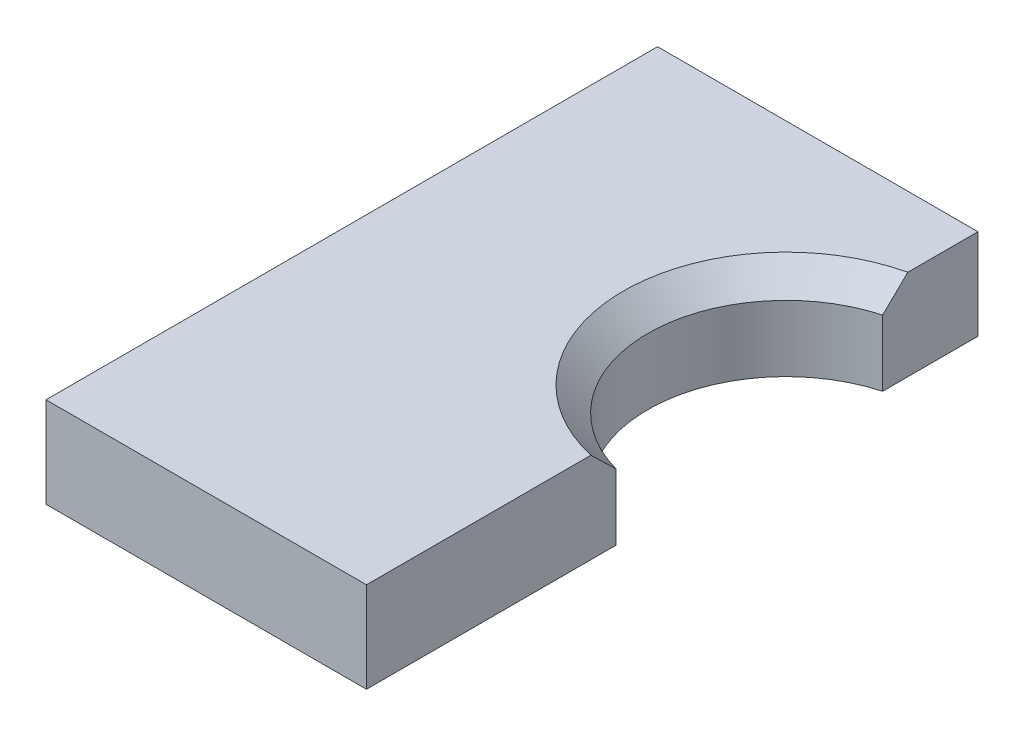
ISO-10303-21;
HEADER;
FILE_DESCRIPTION(('STEP AP214'),'2;1');
FILE_NAME('part.step','',(''),(''),'','','');
FILE_SCHEMA(('AUTOMOTIVE_DESIGN { 1 0 10303 214 1 1 1 1 }'));
ENDSEC;
DATA;
#1=APPLICATION_CONTEXT('core data for automotive mechanical design processes');
#2=APPLICATION_PROTOCOL_DEFINITION('international standard','automotive_design',2000,#1);
#3=PRODUCT_CONTEXT('',#1,'mechanical');
#4=PRODUCT('Part','Part','',(#3));
#5=PRODUCT_RELATED_PRODUCT_CATEGORY('part','',(#4));
#6=PRODUCT_DEFINITION_FORMATION('','',#4);
#7=PRODUCT_DEFINITION_CONTEXT('part definition',#1,'design');
#8=PRODUCT_DEFINITION('design','',#6,#7);
#9=PRODUCT_DEFINITION_SHAPE('','',#8);
#10=(LENGTH_UNIT() NAMED_UNIT(*) SI_UNIT(.MILLI.,.METRE.));
#11=(NAMED_UNIT(*) PLANE_ANGLE_UNIT() SI_UNIT($,.RADIAN.));
#12=(NAMED_UNIT(*) SI_UNIT($,.STERADIAN.) SOLID_ANGLE_UNIT());
#13=UNCERTAINTY_MEASURE_WITH_UNIT(LENGTH_MEASURE(1.E-05),#10,'distance_accuracy_value','');
#14=(GEOMETRIC_REPRESENTATION_CONTEXT(3) GLOBAL_UNCERTAINTY_ASSIGNED_CONTEXT((#13)) GLOBAL_UNIT_ASSIGNED_CONTEXT((#10,
#11,#12)) REPRESENTATION_CONTEXT('',''));
#15=CARTESIAN_POINT('',(0.,0.,0.));
#16=DIRECTION('',(0.,0.,1.));
#17=DIRECTION('',(1.,0.,0.));
#18=AXIS2_PLACEMENT_3D('',#15,#16,#17);
#19=CARTESIAN_POINT('',(14.6,3.7,-19.65));
#20=DIRECTION('',(0.,-1.,0.));
#21=DIRECTION('',(0.,0.,-1.));
#22=AXIS2_PLACEMENT_3D('',#19,#20,#21);
#23=CYLINDRICAL_SURFACE('',#22,5.65);
#24=DIRECTION('',(0.,-1.,0.));
#25=VECTOR('',#24,1.);
#26=CARTESIAN_POINT('',(13.1,3.7,-25.0972470111057));
#27=LINE('',#26,#25);
#28=CARTESIAN_POINT('',(13.1,2.69999999999999,-25.0972470111057));
#29=VERTEX_POINT('',#28);
#30=CARTESIAN_POINT('',(13.1,0.,-25.0972470111057));
#31=VERTEX_POINT('',#30);
#32=EDGE_CURVE('E135',#29,#31,#27,.T.);
#33=ORIENTED_EDGE('',*,*,#32,.F.);
#34=CARTESIAN_POINT('',(14.6,2.69999999999999,-19.65));
#35=DIRECTION('',(0.,1.,0.));
#36=DIRECTION('',(0.,0.,1.));
#37=AXIS2_PLACEMENT_3D('',#34,#35,#36);
#38=CIRCLE('',#37,5.65);
#39=CARTESIAN_POINT('',(13.1,2.69999999999999,-14.2027529888943));
#40=VERTEX_POINT('',#39);
#41=EDGE_CURVE('E178',#29,#40,#38,.T.);
#42=ORIENTED_EDGE('',*,*,#41,.T.);
#43=DIRECTION('',(0.,-1.,0.));
#44=VECTOR('',#43,1.);
#45=CARTESIAN_POINT('',(13.1,3.7,-14.2027529888943));
#46=LINE('',#45,#44);
#47=CARTESIAN_POINT('',(13.1,0.,-14.2027529888943));
#48=VERTEX_POINT('',#47);
#49=EDGE_CURVE('E164',#40,#48,#46,.T.);
#50=ORIENTED_EDGE('',*,*,#49,.T.);
#51=CARTESIAN_POINT('',(14.6,0.,-19.65));
#52=DIRECTION('',(0.,1.,0.));
#53=DIRECTION('',(0.,0.,1.));
#54=AXIS2_PLACEMENT_3D('',#51,#52,#53);
#55=CIRCLE('',#54,5.65);
#56=EDGE_CURVE('E148',#31,#48,#55,.T.);
#57=ORIENTED_EDGE('',*,*,#56,.F.);
#58=EDGE_LOOP('',(#33,#42,#50,#57));
#59=FACE_BOUND('',#58,.T.);
#60=ADVANCED_FACE('F49',(#59),#23,.F.);
#61=CARTESIAN_POINT('',(13.1,3.7,0.));
#62=DIRECTION('',(-1.,0.,0.));
#63=DIRECTION('',(0.,0.,1.));
#64=AXIS2_PLACEMENT_3D('',#61,#62,#63);
#65=PLANE('',#64);
#66=DIRECTION('',(0.,0.,-1.));
#67=VECTOR('',#66,1.);
#68=CARTESIAN_POINT('',(13.1,3.7,0.));
#69=LINE('',#68,#67);
#70=CARTESIAN_POINT('',(13.1,3.7,-26.1286186799348));
#71=VERTEX_POINT('',#70);
#72=CARTESIAN_POINT('',(13.1,3.7,-28.9972470111057));
#73=VERTEX_POINT('',#72);
#74=EDGE_CURVE('E113',#71,#73,#69,.T.);
#75=ORIENTED_EDGE('',*,*,#74,.F.);
#76=CARTESIAN_POINT('',(13.1,3.7,-26.1286186799348));
#77=CARTESIAN_POINT('',(13.1,3.61646172938487,-26.0428699402354));
#78=CARTESIAN_POINT('',(13.1,3.53296614374926,-25.9570795900868));
#79=CARTESIAN_POINT('',(13.1,3.36607283627571,-25.7854040370785));
#80=CARTESIAN_POINT('',(13.1,3.28267511427363,-25.6995188343785));
#81=CARTESIAN_POINT('',(13.1,3.11598971569389,-25.5276416239988));
#82=CARTESIAN_POINT('',(13.1,3.03270203915782,-25.4416496162788));
#83=CARTESIAN_POINT('',(13.1,2.86625257730064,-25.2695435746787));
#84=CARTESIAN_POINT('',(13.1,2.78309079219145,-25.1834295405936));
#85=CARTESIAN_POINT('',(13.1,2.69999999999999,-25.0972470111057));
#86=B_SPLINE_CURVE_WITH_KNOTS('',3,(#76,#77,#78,#79,#80,#81,#82,#83,#84,#85),.UNSPECIFIED.,.F.,
.F.,(4,2,2,2,4),(0.,0.359142603203575,0.718284603145415,1.07742673876672,1.43656947830734),.UNSPECIFIED.);
#87=EDGE_CURVE('E11',#71,#29,#86,.T.);
#88=ORIENTED_EDGE('',*,*,#87,.T.);
#89=ORIENTED_EDGE('',*,*,#32,.T.);
#90=DIRECTION('',(0.,0.,-1.));
#91=VECTOR('',#90,1.);
#92=CARTESIAN_POINT('',(13.1,0.,0.));
#93=LINE('',#92,#91);
#94=CARTESIAN_POINT('',(13.1,0.,-28.9972470111057));
#95=VERTEX_POINT('',#94);
#96=EDGE_CURVE('E130',#31,#95,#93,.T.);
#97=ORIENTED_EDGE('',*,*,#96,.T.);
#98=DIRECTION('',(0.,-1.,0.));
#99=VECTOR('',#98,1.);
#100=CARTESIAN_POINT('',(13.1,3.7,-28.9972470111057));
#101=LINE('',#100,#99);
#102=EDGE_CURVE('E127',#73,#95,#101,.T.);
#103=ORIENTED_EDGE('',*,*,#102,.F.);
#104=EDGE_LOOP('',(#75,#88,#89,#97,#103));
#105=FACE_BOUND('',#104,.T.);
#106=ADVANCED_FACE('F128',(#105),#65,.F.);
#107=CARTESIAN_POINT('',(0.,3.7,-28.9972470111057));
#108=DIRECTION('',(0.,0.,-1.));
#109=DIRECTION('',(-1.,0.,0.));
#110=AXIS2_PLACEMENT_3D('',#107,#108,#109);
#111=PLANE('',#110);
#112=DIRECTION('',(1.,0.,0.));
#113=VECTOR('',#112,1.);
#114=CARTESIAN_POINT('',(0.,0.,-28.9972470111057));
#115=LINE('',#114,#113);
#116=CARTESIAN_POINT('',(0.,0.,-28.9972470111057));
#117=VERTEX_POINT('',#116);
#118=EDGE_CURVE('E154',#117,#95,#115,.T.);
#119=ORIENTED_EDGE('',*,*,#118,.F.);
#120=DIRECTION('',(0.,-1.,0.));
#121=VECTOR('',#120,1.);
#122=CARTESIAN_POINT('',(0.,3.7,-28.9972470111057));
#123=LINE('',#122,#121);
#124=CARTESIAN_POINT('',(0.,3.7,-28.9972470111057));
#125=VERTEX_POINT('',#124);
#126=EDGE_CURVE('E136',#125,#117,#123,.T.);
#127=ORIENTED_EDGE('',*,*,#126,.F.);
#128=DIRECTION('',(1.,0.,0.));
#129=VECTOR('',#128,1.);
#130=CARTESIAN_POINT('',(0.,3.7,-28.9972470111057));
#131=LINE('',#130,#129);
#132=EDGE_CURVE('E118',#125,#73,#131,.T.);
#133=ORIENTED_EDGE('',*,*,#132,.T.);
#134=ORIENTED_EDGE('',*,*,#102,.T.);
#135=EDGE_LOOP('',(#119,#127,#133,#134));
#136=FACE_BOUND('',#135,.T.);
#137=ADVANCED_FACE('F138',(#136),#111,.T.);
#138=CARTESIAN_POINT('',(0.,3.7,0.));
#139=DIRECTION('',(-1.,0.,0.));
#140=DIRECTION('',(0.,0.,1.));
#141=AXIS2_PLACEMENT_3D('',#138,#139,#140);
#142=PLANE('',#141);
#143=DIRECTION('',(0.,0.,-1.));
#144=VECTOR('',#143,1.);
#145=CARTESIAN_POINT('',(0.,0.,0.));
#146=LINE('',#145,#144);
#147=CARTESIAN_POINT('',(0.,0.,-4.));
#148=VERTEX_POINT('',#147);
#149=EDGE_CURVE('E157',#148,#117,#146,.T.);
#150=ORIENTED_EDGE('',*,*,#149,.F.);
#151=DIRECTION('',(0.,-1.,0.));
#152=VECTOR('',#151,1.);
#153=CARTESIAN_POINT('',(0.,3.7,-4.));
#154=LINE('',#153,#152);
#155=CARTESIAN_POINT('',(0.,3.7,-4.));
#156=VERTEX_POINT('',#155);
#157=EDGE_CURVE('E171',#156,#148,#154,.T.);
#158=ORIENTED_EDGE('',*,*,#157,.F.);
#159=DIRECTION('',(0.,0.,-1.));
#160=VECTOR('',#159,1.);
#161=CARTESIAN_POINT('',(0.,3.7,0.));
#162=LINE('',#161,#160);
#163=EDGE_CURVE('E140',#156,#125,#162,.T.);
#164=ORIENTED_EDGE('',*,*,#163,.T.);
#165=ORIENTED_EDGE('',*,*,#126,.T.);
#166=EDGE_LOOP('',(#150,#158,#164,#165));
#167=FACE_BOUND('',#166,.T.);
#168=ADVANCED_FACE('F198',(#167),#142,.T.);
#169=CARTESIAN_POINT('',(0.,3.7,-4.));
#170=DIRECTION('',(0.,0.,-1.));
#171=DIRECTION('',(-1.,0.,0.));
#172=AXIS2_PLACEMENT_3D('',#169,#170,#171);
#173=PLANE('',#172);
#174=DIRECTION('',(1.,0.,0.));
#175=VECTOR('',#174,1.);
#176=CARTESIAN_POINT('',(0.,0.,-4.));
#177=LINE('',#176,#175);
#178=CARTESIAN_POINT('',(13.1,0.,-4.));
#179=VERTEX_POINT('',#178);
#180=EDGE_CURVE('E161',#148,#179,#177,.T.);
#181=ORIENTED_EDGE('',*,*,#180,.T.);
#182=DIRECTION('',(0.,-1.,0.));
#183=VECTOR('',#182,1.);
#184=CARTESIAN_POINT('',(13.1,3.7,-4.));
#185=LINE('',#184,#183);
#186=CARTESIAN_POINT('',(13.1,3.7,-4.));
#187=VERTEX_POINT('',#186);
#188=EDGE_CURVE('E167',#187,#179,#185,.T.);
#189=ORIENTED_EDGE('',*,*,#188,.F.);
#190=DIRECTION('',(1.,0.,0.));
#191=VECTOR('',#190,1.);
#192=CARTESIAN_POINT('',(0.,3.7,-4.));
#193=LINE('',#192,#191);
#194=EDGE_CURVE('E143',#156,#187,#193,.T.);
#195=ORIENTED_EDGE('',*,*,#194,.F.);
#196=ORIENTED_EDGE('',*,*,#157,.T.);
#197=EDGE_LOOP('',(#181,#189,#195,#196));
#198=FACE_BOUND('',#197,.T.);
#199=ADVANCED_FACE('F192',(#198),#173,.F.);
#200=ORIENTED_EDGE('',*,*,#49,.F.);
#201=CARTESIAN_POINT('',(13.1,2.69999999999999,-14.2027529888943));
#202=CARTESIAN_POINT('',(13.1,2.78309079219145,-14.1165704594064));
#203=CARTESIAN_POINT('',(13.1,2.86625257730064,-14.0304564253213));
#204=CARTESIAN_POINT('',(13.1,3.03270203915782,-13.8583503837212));
#205=CARTESIAN_POINT('',(13.1,3.11598971569389,-13.7723583760012));
#206=CARTESIAN_POINT('',(13.1,3.28267511427363,-13.6004811656215));
#207=CARTESIAN_POINT('',(13.1,3.36607283627571,-13.5145959629215));
#208=CARTESIAN_POINT('',(13.1,3.53296614374926,-13.3429204099132));
#209=CARTESIAN_POINT('',(13.1,3.61646172938487,-13.2571300597646));
#210=CARTESIAN_POINT('',(13.1,3.7,-13.1713813200652));
#211=B_SPLINE_CURVE_WITH_KNOTS('',3,(#201,#202,#203,#204,#205,#206,#207,#208,#209,#210),
.UNSPECIFIED.,.F.,.F.,(4,2,2,2,4),(0.,0.359142739540621,0.718284875161927,1.07742687510377,
1.43656947830734),.UNSPECIFIED.);
#212=CARTESIAN_POINT('',(13.1,3.7,-13.1713813200652));
#213=VERTEX_POINT('',#212);
#214=EDGE_CURVE('E79',#40,#213,#211,.T.);
#215=ORIENTED_EDGE('',*,*,#214,.T.);
#216=EDGE_CURVE('E125',#187,#213,#69,.T.);
#217=ORIENTED_EDGE('',*,*,#216,.F.);
#218=ORIENTED_EDGE('',*,*,#188,.T.);
#219=EDGE_CURVE('E123',#179,#48,#93,.T.);
#220=ORIENTED_EDGE('',*,*,#219,.T.);
#221=EDGE_LOOP('',(#200,#215,#217,#218,#220));
#222=FACE_BOUND('',#221,.T.);
#223=ADVANCED_FACE('F187',(#222),#65,.F.);
#224=CARTESIAN_POINT('',(0.,3.7,0.));
#225=DIRECTION('',(0.,1.,0.));
#226=DIRECTION('',(0.,0.,1.));
#227=AXIS2_PLACEMENT_3D('',#224,#225,#226);
#228=PLANE('',#227);
#229=ORIENTED_EDGE('',*,*,#216,.T.);
#230=CARTESIAN_POINT('',(14.6,3.7,-19.65));
#231=DIRECTION('',(0.,1.,0.));
#232=DIRECTION('',(0.,0.,1.));
#233=AXIS2_PLACEMENT_3D('',#230,#231,#232);
#234=CIRCLE('',#233,6.65000000000001);
#235=EDGE_CURVE('E65',#213,#71,#234,.F.);
#236=ORIENTED_EDGE('',*,*,#235,.T.);
#237=ORIENTED_EDGE('',*,*,#74,.T.);
#238=ORIENTED_EDGE('',*,*,#132,.F.);
#239=ORIENTED_EDGE('',*,*,#163,.F.);
#240=ORIENTED_EDGE('',*,*,#194,.T.);
#241=EDGE_LOOP('',(#229,#236,#237,#238,#239,#240));
#242=FACE_BOUND('',#241,.T.);
#243=ADVANCED_FACE('F115',(#242),#228,.T.);
#244=CARTESIAN_POINT('',(0.,0.,0.));
#245=DIRECTION('',(0.,1.,0.));
#246=DIRECTION('',(0.,0.,1.));
#247=AXIS2_PLACEMENT_3D('',#244,#245,#246);
#248=PLANE('',#247);
#249=ORIENTED_EDGE('',*,*,#56,.T.);
#250=ORIENTED_EDGE('',*,*,#219,.F.);
#251=ORIENTED_EDGE('',*,*,#180,.F.);
#252=ORIENTED_EDGE('',*,*,#149,.T.);
#253=ORIENTED_EDGE('',*,*,#118,.T.);
#254=ORIENTED_EDGE('',*,*,#96,.F.);
#255=EDGE_LOOP('',(#249,#250,#251,#252,#253,#254));
#256=FACE_BOUND('',#255,.T.);
#257=ADVANCED_FACE('F193',(#256),#248,.F.);
#258=CARTESIAN_POINT('',(14.6,2.69999999999999,-19.65));
#259=DIRECTION('',(0.,1.,0.));
#260=DIRECTION('',(0.,0.,1.));
#261=AXIS2_PLACEMENT_3D('',#258,#259,#260);
#262=CONICAL_SURFACE('',#261,5.65,0.78539816339745);
#263=ORIENTED_EDGE('',*,*,#87,.F.);
#264=ORIENTED_EDGE('',*,*,#235,.F.);
#265=ORIENTED_EDGE('',*,*,#214,.F.);
#266=ORIENTED_EDGE('',*,*,#41,.F.);
#267=EDGE_LOOP('',(#263,#264,#265,#266));
#268=FACE_BOUND('',#267,.T.);
#269=ADVANCED_FACE('F52',(#268),#262,.F.);
#270=CLOSED_SHELL('',(#60,#106,#137,#168,#199,#223,#243,#257,#269));
#271=MANIFOLD_SOLID_BREP('B2',#270);
#272=ADVANCED_BREP_SHAPE_REPRESENTATION('',(#18,#271),#14);
#273=SHAPE_DEFINITION_REPRESENTATION(#9,#272);
ENDSEC;
END-ISO-10303-21;
